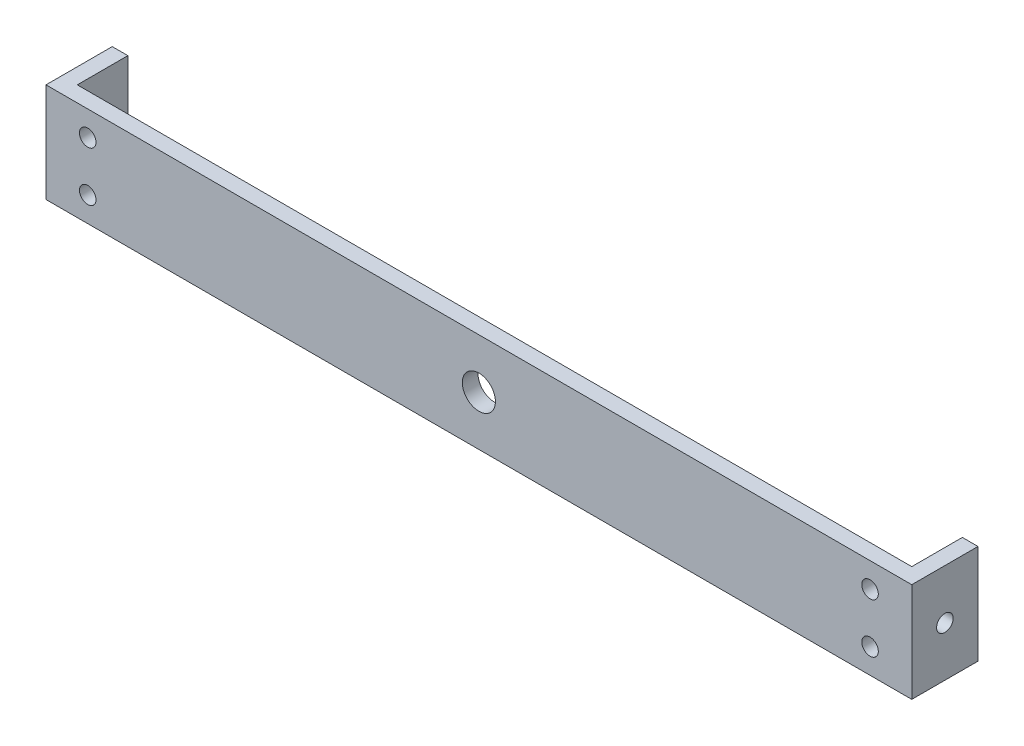
ISO-10303-21;
HEADER;
FILE_DESCRIPTION(('STEP AP214'),'2;1');
FILE_NAME('part.step','',(''),(''),'','','');
FILE_SCHEMA(('AUTOMOTIVE_DESIGN { 1 0 10303 214 1 1 1 1 }'));
ENDSEC;
DATA;
#1=APPLICATION_CONTEXT('core data for automotive mechanical design processes');
#2=APPLICATION_PROTOCOL_DEFINITION('international standard','automotive_design',2000,#1);
#3=PRODUCT_CONTEXT('',#1,'mechanical');
#4=PRODUCT('Part','Part','',(#3));
#5=PRODUCT_RELATED_PRODUCT_CATEGORY('part','',(#4));
#6=PRODUCT_DEFINITION_FORMATION('','',#4);
#7=PRODUCT_DEFINITION_CONTEXT('part definition',#1,'design');
#8=PRODUCT_DEFINITION('design','',#6,#7);
#9=PRODUCT_DEFINITION_SHAPE('','',#8);
#10=(LENGTH_UNIT() NAMED_UNIT(*) SI_UNIT(.MILLI.,.METRE.));
#11=(NAMED_UNIT(*) PLANE_ANGLE_UNIT() SI_UNIT($,.RADIAN.));
#12=(NAMED_UNIT(*) SI_UNIT($,.STERADIAN.) SOLID_ANGLE_UNIT());
#13=UNCERTAINTY_MEASURE_WITH_UNIT(LENGTH_MEASURE(1.E-05),#10,'distance_accuracy_value','');
#14=(GEOMETRIC_REPRESENTATION_CONTEXT(3) GLOBAL_UNCERTAINTY_ASSIGNED_CONTEXT((#13)) GLOBAL_UNIT_ASSIGNED_CONTEXT((#10,
#11,#12)) REPRESENTATION_CONTEXT('',''));
#15=CARTESIAN_POINT('',(0.,0.,0.));
#16=DIRECTION('',(0.,0.,1.));
#17=DIRECTION('',(1.,0.,0.));
#18=AXIS2_PLACEMENT_3D('',#15,#16,#17);
#19=CARTESIAN_POINT('',(-182.712979417389,0.,-6.7));
#20=DIRECTION('',(1.,0.,0.));
#21=DIRECTION('',(0.,0.,-1.));
#22=AXIS2_PLACEMENT_3D('',#19,#20,#21);
#23=CYLINDRICAL_SURFACE('',#22,3.17500000000015);
#24=CARTESIAN_POINT('',(-166.,0.,-6.7));
#25=DIRECTION('',(1.,0.,0.));
#26=DIRECTION('',(0.,0.,-1.));
#27=AXIS2_PLACEMENT_3D('',#24,#25,#26);
#28=CIRCLE('',#27,3.17500000000015);
#29=CARTESIAN_POINT('',(-166.,0.,-9.87500000000015));
#30=VERTEX_POINT('',#29);
#31=EDGE_CURVE('E141',#30,#30,#28,.T.);
#32=ORIENTED_EDGE('',*,*,#31,.F.);
#33=EDGE_LOOP('',(#32));
#34=FACE_BOUND('',#33,.T.);
#35=CARTESIAN_POINT('',(-160.,0.,-6.7));
#36=DIRECTION('',(1.,0.,0.));
#37=DIRECTION('',(0.,0.,-1.));
#38=AXIS2_PLACEMENT_3D('',#35,#36,#37);
#39=CIRCLE('',#38,3.17500000000015);
#40=CARTESIAN_POINT('',(-160.,0.,-9.87500000000015));
#41=VERTEX_POINT('',#40);
#42=EDGE_CURVE('E20',#41,#41,#39,.F.);
#43=ORIENTED_EDGE('',*,*,#42,.F.);
#44=EDGE_LOOP('',(#43));
#45=FACE_BOUND('',#44,.T.);
#46=ADVANCED_FACE('F17',(#34,#45),#23,.F.);
#47=CARTESIAN_POINT('',(-160.,19.05,-19.4));
#48=DIRECTION('',(1.,0.,0.));
#49=DIRECTION('',(0.,0.,-1.));
#50=AXIS2_PLACEMENT_3D('',#47,#48,#49);
#51=PLANE('',#50);
#52=DIRECTION('',(0.,0.,1.));
#53=VECTOR('',#52,1.);
#54=CARTESIAN_POINT('',(-160.,-19.05,6.));
#55=LINE('',#54,#53);
#56=CARTESIAN_POINT('',(-160.,-19.05,0.));
#57=VERTEX_POINT('',#56);
#58=CARTESIAN_POINT('',(-160.,-19.05,-19.4));
#59=VERTEX_POINT('',#58);
#60=EDGE_CURVE('E241',#57,#59,#55,.F.);
#61=ORIENTED_EDGE('',*,*,#60,.T.);
#62=DIRECTION('',(0.,1.,0.));
#63=VECTOR('',#62,1.);
#64=CARTESIAN_POINT('',(-160.,0.,-19.4));
#65=LINE('',#64,#63);
#66=CARTESIAN_POINT('',(-160.,19.05,-19.4));
#67=VERTEX_POINT('',#66);
#68=EDGE_CURVE('E118',#67,#59,#65,.F.);
#69=ORIENTED_EDGE('',*,*,#68,.F.);
#70=DIRECTION('',(0.,0.,1.));
#71=VECTOR('',#70,1.);
#72=CARTESIAN_POINT('',(-160.,19.05,6.));
#73=LINE('',#72,#71);
#74=CARTESIAN_POINT('',(-160.,19.05,0.));
#75=VERTEX_POINT('',#74);
#76=EDGE_CURVE('E110',#67,#75,#73,.T.);
#77=ORIENTED_EDGE('',*,*,#76,.T.);
#78=DIRECTION('',(0.,1.,0.));
#79=VECTOR('',#78,1.);
#80=CARTESIAN_POINT('',(-160.,0.,0.));
#81=LINE('',#80,#79);
#82=EDGE_CURVE('E114',#75,#57,#81,.F.);
#83=ORIENTED_EDGE('',*,*,#82,.T.);
#84=EDGE_LOOP('',(#61,#69,#77,#83));
#85=FACE_BOUND('',#84,.T.);
#86=ORIENTED_EDGE('',*,*,#42,.T.);
#87=EDGE_LOOP('',(#86));
#88=FACE_BOUND('',#87,.T.);
#89=ADVANCED_FACE('F274',(#85,#88),#51,.T.);
#90=CARTESIAN_POINT('',(0.,0.,-19.4));
#91=DIRECTION('',(0.,0.,-1.));
#92=DIRECTION('',(-1.,0.,0.));
#93=AXIS2_PLACEMENT_3D('',#90,#91,#92);
#94=PLANE('',#93);
#95=DIRECTION('',(0.,1.,0.));
#96=VECTOR('',#95,1.);
#97=CARTESIAN_POINT('',(-166.,19.05,-19.4));
#98=LINE('',#97,#96);
#99=CARTESIAN_POINT('',(-166.,19.05,-19.4));
#100=VERTEX_POINT('',#99);
#101=CARTESIAN_POINT('',(-166.,-19.05,-19.4));
#102=VERTEX_POINT('',#101);
#103=EDGE_CURVE('E238',#100,#102,#98,.F.);
#104=ORIENTED_EDGE('',*,*,#103,.F.);
#105=DIRECTION('',(1.,0.,0.));
#106=VECTOR('',#105,1.);
#107=CARTESIAN_POINT('',(160.,19.0500000000001,-19.4));
#108=LINE('',#107,#106);
#109=EDGE_CURVE('E107',#100,#67,#108,.T.);
#110=ORIENTED_EDGE('',*,*,#109,.T.);
#111=ORIENTED_EDGE('',*,*,#68,.T.);
#112=DIRECTION('',(-1.,0.,0.));
#113=VECTOR('',#112,1.);
#114=CARTESIAN_POINT('',(160.,-19.05,-19.4));
#115=LINE('',#114,#113);
#116=EDGE_CURVE('E243',#59,#102,#115,.T.);
#117=ORIENTED_EDGE('',*,*,#116,.T.);
#118=EDGE_LOOP('',(#104,#110,#111,#117));
#119=FACE_BOUND('',#118,.T.);
#120=ADVANCED_FACE('F169',(#119),#94,.T.);
#121=CARTESIAN_POINT('',(160.,19.0500000000001,-19.4));
#122=DIRECTION('',(-1.,0.,0.));
#123=DIRECTION('',(0.,0.,1.));
#124=AXIS2_PLACEMENT_3D('',#121,#122,#123);
#125=PLANE('',#124);
#126=DIRECTION('',(0.,0.,1.));
#127=VECTOR('',#126,1.);
#128=CARTESIAN_POINT('',(160.,19.0500000000001,6.));
#129=LINE('',#128,#127);
#130=CARTESIAN_POINT('',(160.,19.0500000000001,0.));
#131=VERTEX_POINT('',#130);
#132=CARTESIAN_POINT('',(160.,19.0500000000001,-19.4));
#133=VERTEX_POINT('',#132);
#134=EDGE_CURVE('E82',#131,#133,#129,.F.);
#135=ORIENTED_EDGE('',*,*,#134,.T.);
#136=DIRECTION('',(0.,1.,0.));
#137=VECTOR('',#136,1.);
#138=CARTESIAN_POINT('',(160.,0.,-19.4));
#139=LINE('',#138,#137);
#140=CARTESIAN_POINT('',(160.,-19.05,-19.4));
#141=VERTEX_POINT('',#140);
#142=EDGE_CURVE('E86',#133,#141,#139,.F.);
#143=ORIENTED_EDGE('',*,*,#142,.T.);
#144=DIRECTION('',(0.,0.,1.));
#145=VECTOR('',#144,1.);
#146=CARTESIAN_POINT('',(160.,-19.05,6.));
#147=LINE('',#146,#145);
#148=CARTESIAN_POINT('',(160.,-19.05,0.));
#149=VERTEX_POINT('',#148);
#150=EDGE_CURVE('E248',#141,#149,#147,.T.);
#151=ORIENTED_EDGE('',*,*,#150,.T.);
#152=DIRECTION('',(0.,1.,0.));
#153=VECTOR('',#152,1.);
#154=CARTESIAN_POINT('',(160.,0.,0.));
#155=LINE('',#154,#153);
#156=EDGE_CURVE('E79',#149,#131,#155,.T.);
#157=ORIENTED_EDGE('',*,*,#156,.T.);
#158=EDGE_LOOP('',(#135,#143,#151,#157));
#159=FACE_BOUND('',#158,.T.);
#160=CARTESIAN_POINT('',(160.,0.,-6.7));
#161=DIRECTION('',(1.,0.,0.));
#162=DIRECTION('',(0.,0.,-1.));
#163=AXIS2_PLACEMENT_3D('',#160,#161,#162);
#164=CIRCLE('',#163,3.17500000000015);
#165=CARTESIAN_POINT('',(160.,0.,-9.87500000000015));
#166=VERTEX_POINT('',#165);
#167=EDGE_CURVE('E100',#166,#166,#164,.T.);
#168=ORIENTED_EDGE('',*,*,#167,.T.);
#169=EDGE_LOOP('',(#168));
#170=FACE_BOUND('',#169,.T.);
#171=ADVANCED_FACE('F84',(#159,#170),#125,.T.);
#172=CARTESIAN_POINT('',(-182.712979417389,0.,-6.7));
#173=DIRECTION('',(1.,0.,0.));
#174=DIRECTION('',(0.,0.,-1.));
#175=AXIS2_PLACEMENT_3D('',#172,#173,#174);
#176=CYLINDRICAL_SURFACE('',#175,3.17500000000015);
#177=CARTESIAN_POINT('',(166.,0.,-6.7));
#178=DIRECTION('',(1.,0.,0.));
#179=DIRECTION('',(0.,0.,-1.));
#180=AXIS2_PLACEMENT_3D('',#177,#178,#179);
#181=CIRCLE('',#180,3.17500000000015);
#182=CARTESIAN_POINT('',(166.,0.,-9.87500000000015));
#183=VERTEX_POINT('',#182);
#184=EDGE_CURVE('E137',#183,#183,#181,.F.);
#185=ORIENTED_EDGE('',*,*,#184,.F.);
#186=EDGE_LOOP('',(#185));
#187=FACE_BOUND('',#186,.T.);
#188=ORIENTED_EDGE('',*,*,#167,.F.);
#189=EDGE_LOOP('',(#188));
#190=FACE_BOUND('',#189,.T.);
#191=ADVANCED_FACE('F158',(#187,#190),#176,.F.);
#192=CARTESIAN_POINT('',(0.,0.,-19.4));
#193=DIRECTION('',(0.,0.,1.));
#194=DIRECTION('',(1.,0.,0.));
#195=AXIS2_PLACEMENT_3D('',#192,#193,#194);
#196=PLANE('',#195);
#197=DIRECTION('',(1.,0.,0.));
#198=VECTOR('',#197,1.);
#199=CARTESIAN_POINT('',(160.,19.0500000000001,-19.4));
#200=LINE('',#199,#198);
#201=CARTESIAN_POINT('',(166.,19.0500000000001,-19.4));
#202=VERTEX_POINT('',#201);
#203=EDGE_CURVE('E91',#133,#202,#200,.T.);
#204=ORIENTED_EDGE('',*,*,#203,.T.);
#205=DIRECTION('',(0.,1.,0.));
#206=VECTOR('',#205,1.);
#207=CARTESIAN_POINT('',(166.,19.0500000000001,-19.4));
#208=LINE('',#207,#206);
#209=CARTESIAN_POINT('',(166.,-19.05,-19.4));
#210=VERTEX_POINT('',#209);
#211=EDGE_CURVE('E252',#210,#202,#208,.T.);
#212=ORIENTED_EDGE('',*,*,#211,.F.);
#213=DIRECTION('',(-1.,0.,0.));
#214=VECTOR('',#213,1.);
#215=CARTESIAN_POINT('',(160.,-19.05,-19.4));
#216=LINE('',#215,#214);
#217=EDGE_CURVE('E98',#210,#141,#216,.T.);
#218=ORIENTED_EDGE('',*,*,#217,.T.);
#219=ORIENTED_EDGE('',*,*,#142,.F.);
#220=EDGE_LOOP('',(#204,#212,#218,#219));
#221=FACE_BOUND('',#220,.T.);
#222=ADVANCED_FACE('F95',(#221),#196,.F.);
#223=CARTESIAN_POINT('',(0.,0.,0.));
#224=DIRECTION('',(0.,0.,1.));
#225=DIRECTION('',(1.,0.,0.));
#226=AXIS2_PLACEMENT_3D('',#223,#224,#225);
#227=PLANE('',#226);
#228=CARTESIAN_POINT('',(0.,0.,0.));
#229=DIRECTION('',(0.,0.,-1.));
#230=DIRECTION('',(-1.,0.,0.));
#231=AXIS2_PLACEMENT_3D('',#228,#229,#230);
#232=CIRCLE('',#231,6.35);
#233=CARTESIAN_POINT('',(-6.34999999999994,0.,0.));
#234=VERTEX_POINT('',#233);
#235=EDGE_CURVE('E134',#234,#234,#232,.F.);
#236=ORIENTED_EDGE('',*,*,#235,.T.);
#237=EDGE_LOOP('',(#236));
#238=FACE_BOUND('',#237,.T.);
#239=DIRECTION('',(1.,0.,0.));
#240=VECTOR('',#239,1.);
#241=CARTESIAN_POINT('',(160.,19.0500000000001,0.));
#242=LINE('',#241,#240);
#243=EDGE_CURVE('E145',#75,#131,#242,.T.);
#244=ORIENTED_EDGE('',*,*,#243,.T.);
#245=ORIENTED_EDGE('',*,*,#156,.F.);
#246=DIRECTION('',(-1.,0.,0.));
#247=VECTOR('',#246,1.);
#248=CARTESIAN_POINT('',(160.,-19.05,0.));
#249=LINE('',#248,#247);
#250=EDGE_CURVE('E140',#149,#57,#249,.T.);
#251=ORIENTED_EDGE('',*,*,#250,.T.);
#252=ORIENTED_EDGE('',*,*,#82,.F.);
#253=EDGE_LOOP('',(#244,#245,#251,#252));
#254=FACE_BOUND('',#253,.T.);
#255=CARTESIAN_POINT('',(-150.,9.52500000000004,0.));
#256=DIRECTION('',(0.,0.,-1.));
#257=DIRECTION('',(-1.,0.,0.));
#258=AXIS2_PLACEMENT_3D('',#255,#256,#257);
#259=CIRCLE('',#258,3.17500000000001);
#260=CARTESIAN_POINT('',(-153.175,9.52500000000004,0.));
#261=VERTEX_POINT('',#260);
#262=EDGE_CURVE('E92',#261,#261,#259,.F.);
#263=ORIENTED_EDGE('',*,*,#262,.T.);
#264=EDGE_LOOP('',(#263));
#265=FACE_BOUND('',#264,.T.);
#266=CARTESIAN_POINT('',(150.,9.52500000000026,0.));
#267=DIRECTION('',(0.,0.,-1.));
#268=DIRECTION('',(-1.,0.,0.));
#269=AXIS2_PLACEMENT_3D('',#266,#267,#268);
#270=CIRCLE('',#269,3.17500000000001);
#271=CARTESIAN_POINT('',(146.825,9.52500000000026,0.));
#272=VERTEX_POINT('',#271);
#273=EDGE_CURVE('E148',#272,#272,#270,.F.);
#274=ORIENTED_EDGE('',*,*,#273,.T.);
#275=EDGE_LOOP('',(#274));
#276=FACE_BOUND('',#275,.T.);
#277=CARTESIAN_POINT('',(150.,-9.52499999999975,0.));
#278=DIRECTION('',(0.,0.,-1.));
#279=DIRECTION('',(-1.,0.,0.));
#280=AXIS2_PLACEMENT_3D('',#277,#278,#279);
#281=CIRCLE('',#280,3.17500000000001);
#282=CARTESIAN_POINT('',(146.825,-9.52499999999975,0.));
#283=VERTEX_POINT('',#282);
#284=EDGE_CURVE('E151',#283,#283,#281,.F.);
#285=ORIENTED_EDGE('',*,*,#284,.T.);
#286=EDGE_LOOP('',(#285));
#287=FACE_BOUND('',#286,.T.);
#288=CARTESIAN_POINT('',(-150.,-9.52499999999997,0.));
#289=DIRECTION('',(0.,0.,-1.));
#290=DIRECTION('',(-1.,0.,0.));
#291=AXIS2_PLACEMENT_3D('',#288,#289,#290);
#292=CIRCLE('',#291,3.17500000000001);
#293=CARTESIAN_POINT('',(-153.175,-9.52499999999997,0.));
#294=VERTEX_POINT('',#293);
#295=EDGE_CURVE('E116',#294,#294,#292,.F.);
#296=ORIENTED_EDGE('',*,*,#295,.T.);
#297=EDGE_LOOP('',(#296));
#298=FACE_BOUND('',#297,.T.);
#299=ADVANCED_FACE('F167',(#238,#254,#265,#276,#287,#298),#227,.F.);
#300=CARTESIAN_POINT('',(-150.,-9.52499999999997,25.4));
#301=DIRECTION('',(0.,0.,-1.));
#302=DIRECTION('',(-1.,0.,0.));
#303=AXIS2_PLACEMENT_3D('',#300,#301,#302);
#304=CYLINDRICAL_SURFACE('',#303,3.17500000000001);
#305=CARTESIAN_POINT('',(-150.,-9.52499999999997,6.));
#306=DIRECTION('',(0.,0.,-1.));
#307=DIRECTION('',(-1.,0.,0.));
#308=AXIS2_PLACEMENT_3D('',#305,#306,#307);
#309=CIRCLE('',#308,3.17500000000001);
#310=CARTESIAN_POINT('',(-153.175,-9.52499999999997,6.));
#311=VERTEX_POINT('',#310);
#312=EDGE_CURVE('E131',#311,#311,#309,.T.);
#313=ORIENTED_EDGE('',*,*,#312,.F.);
#314=EDGE_LOOP('',(#313));
#315=FACE_BOUND('',#314,.T.);
#316=ORIENTED_EDGE('',*,*,#295,.F.);
#317=EDGE_LOOP('',(#316));
#318=FACE_BOUND('',#317,.T.);
#319=ADVANCED_FACE('F208',(#315,#318),#304,.F.);
#320=CARTESIAN_POINT('',(150.,-9.52499999999975,25.4));
#321=DIRECTION('',(0.,0.,-1.));
#322=DIRECTION('',(-1.,0.,0.));
#323=AXIS2_PLACEMENT_3D('',#320,#321,#322);
#324=CYLINDRICAL_SURFACE('',#323,3.17500000000001);
#325=CARTESIAN_POINT('',(150.,-9.52499999999975,6.));
#326=DIRECTION('',(0.,0.,-1.));
#327=DIRECTION('',(-1.,0.,0.));
#328=AXIS2_PLACEMENT_3D('',#325,#326,#327);
#329=CIRCLE('',#328,3.17500000000001);
#330=CARTESIAN_POINT('',(146.825,-9.52499999999975,6.));
#331=VERTEX_POINT('',#330);
#332=EDGE_CURVE('E128',#331,#331,#329,.T.);
#333=ORIENTED_EDGE('',*,*,#332,.F.);
#334=EDGE_LOOP('',(#333));
#335=FACE_BOUND('',#334,.T.);
#336=ORIENTED_EDGE('',*,*,#284,.F.);
#337=EDGE_LOOP('',(#336));
#338=FACE_BOUND('',#337,.T.);
#339=ADVANCED_FACE('F204',(#335,#338),#324,.F.);
#340=CARTESIAN_POINT('',(150.,9.52500000000026,25.4));
#341=DIRECTION('',(0.,0.,-1.));
#342=DIRECTION('',(-1.,0.,0.));
#343=AXIS2_PLACEMENT_3D('',#340,#341,#342);
#344=CYLINDRICAL_SURFACE('',#343,3.17500000000001);
#345=CARTESIAN_POINT('',(150.,9.52500000000026,6.));
#346=DIRECTION('',(0.,0.,-1.));
#347=DIRECTION('',(-1.,0.,0.));
#348=AXIS2_PLACEMENT_3D('',#345,#346,#347);
#349=CIRCLE('',#348,3.17500000000001);
#350=CARTESIAN_POINT('',(146.825,9.52500000000026,6.));
#351=VERTEX_POINT('',#350);
#352=EDGE_CURVE('E125',#351,#351,#349,.T.);
#353=ORIENTED_EDGE('',*,*,#352,.F.);
#354=EDGE_LOOP('',(#353));
#355=FACE_BOUND('',#354,.T.);
#356=ORIENTED_EDGE('',*,*,#273,.F.);
#357=EDGE_LOOP('',(#356));
#358=FACE_BOUND('',#357,.T.);
#359=ADVANCED_FACE('F200',(#355,#358),#344,.F.);
#360=CARTESIAN_POINT('',(-150.,9.52500000000004,25.4));
#361=DIRECTION('',(0.,0.,-1.));
#362=DIRECTION('',(-1.,0.,0.));
#363=AXIS2_PLACEMENT_3D('',#360,#361,#362);
#364=CYLINDRICAL_SURFACE('',#363,3.17500000000001);
#365=CARTESIAN_POINT('',(-150.,9.52500000000004,6.));
#366=DIRECTION('',(0.,0.,-1.));
#367=DIRECTION('',(-1.,0.,0.));
#368=AXIS2_PLACEMENT_3D('',#365,#366,#367);
#369=CIRCLE('',#368,3.17500000000001);
#370=CARTESIAN_POINT('',(-153.175,9.52500000000004,6.));
#371=VERTEX_POINT('',#370);
#372=EDGE_CURVE('E121',#371,#371,#369,.T.);
#373=ORIENTED_EDGE('',*,*,#372,.F.);
#374=EDGE_LOOP('',(#373));
#375=FACE_BOUND('',#374,.T.);
#376=ORIENTED_EDGE('',*,*,#262,.F.);
#377=EDGE_LOOP('',(#376));
#378=FACE_BOUND('',#377,.T.);
#379=ADVANCED_FACE('F197',(#375,#378),#364,.F.);
#380=CARTESIAN_POINT('',(160.,19.0500000000001,6.));
#381=DIRECTION('',(0.,-1.,0.));
#382=DIRECTION('',(1.,0.,0.));
#383=AXIS2_PLACEMENT_3D('',#380,#381,#382);
#384=PLANE('',#383);
#385=ORIENTED_EDGE('',*,*,#76,.F.);
#386=ORIENTED_EDGE('',*,*,#109,.F.);
#387=DIRECTION('',(0.,0.,1.));
#388=VECTOR('',#387,1.);
#389=CARTESIAN_POINT('',(-166.,19.05,-19.4));
#390=LINE('',#389,#388);
#391=CARTESIAN_POINT('',(-166.,19.05,6.));
#392=VERTEX_POINT('',#391);
#393=EDGE_CURVE('E144',#392,#100,#390,.F.);
#394=ORIENTED_EDGE('',*,*,#393,.F.);
#395=DIRECTION('',(1.,0.,0.));
#396=VECTOR('',#395,1.);
#397=CARTESIAN_POINT('',(0.,19.0500000000001,6.));
#398=LINE('',#397,#396);
#399=CARTESIAN_POINT('',(166.,19.0500000000001,6.));
#400=VERTEX_POINT('',#399);
#401=EDGE_CURVE('E124',#400,#392,#398,.F.);
#402=ORIENTED_EDGE('',*,*,#401,.F.);
#403=DIRECTION('',(0.,0.,-1.));
#404=VECTOR('',#403,1.);
#405=CARTESIAN_POINT('',(166.,19.0500000000001,-19.4));
#406=LINE('',#405,#404);
#407=EDGE_CURVE('E105',#202,#400,#406,.F.);
#408=ORIENTED_EDGE('',*,*,#407,.F.);
#409=ORIENTED_EDGE('',*,*,#203,.F.);
#410=ORIENTED_EDGE('',*,*,#134,.F.);
#411=ORIENTED_EDGE('',*,*,#243,.F.);
#412=EDGE_LOOP('',(#385,#386,#394,#402,#408,#409,#410,#411));
#413=FACE_BOUND('',#412,.T.);
#414=ADVANCED_FACE('F103',(#413),#384,.F.);
#415=CARTESIAN_POINT('',(-166.,19.05,-19.4));
#416=DIRECTION('',(-1.,0.,0.));
#417=DIRECTION('',(0.,0.,1.));
#418=AXIS2_PLACEMENT_3D('',#415,#416,#417);
#419=PLANE('',#418);
#420=ORIENTED_EDGE('',*,*,#103,.T.);
#421=DIRECTION('',(0.,0.,1.));
#422=VECTOR('',#421,1.);
#423=CARTESIAN_POINT('',(-166.,-19.05,6.));
#424=LINE('',#423,#422);
#425=CARTESIAN_POINT('',(-166.,-19.05,6.));
#426=VERTEX_POINT('',#425);
#427=EDGE_CURVE('E245',#102,#426,#424,.T.);
#428=ORIENTED_EDGE('',*,*,#427,.T.);
#429=DIRECTION('',(0.,1.,0.));
#430=VECTOR('',#429,1.);
#431=CARTESIAN_POINT('',(-166.,0.,6.));
#432=LINE('',#431,#430);
#433=EDGE_CURVE('E257',#392,#426,#432,.F.);
#434=ORIENTED_EDGE('',*,*,#433,.F.);
#435=ORIENTED_EDGE('',*,*,#393,.T.);
#436=EDGE_LOOP('',(#420,#428,#434,#435));
#437=FACE_BOUND('',#436,.T.);
#438=ORIENTED_EDGE('',*,*,#31,.T.);
#439=EDGE_LOOP('',(#438));
#440=FACE_BOUND('',#439,.T.);
#441=ADVANCED_FACE('F191',(#437,#440),#419,.T.);
#442=CARTESIAN_POINT('',(160.,-19.05,6.));
#443=DIRECTION('',(0.,1.,0.));
#444=DIRECTION('',(-1.,0.,0.));
#445=AXIS2_PLACEMENT_3D('',#442,#443,#444);
#446=PLANE('',#445);
#447=ORIENTED_EDGE('',*,*,#150,.F.);
#448=ORIENTED_EDGE('',*,*,#217,.F.);
#449=DIRECTION('',(0.,0.,-1.));
#450=VECTOR('',#449,1.);
#451=CARTESIAN_POINT('',(166.,-19.05,-19.4));
#452=LINE('',#451,#450);
#453=CARTESIAN_POINT('',(166.,-19.05,6.));
#454=VERTEX_POINT('',#453);
#455=EDGE_CURVE('E35',#454,#210,#452,.T.);
#456=ORIENTED_EDGE('',*,*,#455,.F.);
#457=DIRECTION('',(1.,0.,0.));
#458=VECTOR('',#457,1.);
#459=CARTESIAN_POINT('',(0.,-19.05,6.));
#460=LINE('',#459,#458);
#461=EDGE_CURVE('E260',#426,#454,#460,.T.);
#462=ORIENTED_EDGE('',*,*,#461,.F.);
#463=ORIENTED_EDGE('',*,*,#427,.F.);
#464=ORIENTED_EDGE('',*,*,#116,.F.);
#465=ORIENTED_EDGE('',*,*,#60,.F.);
#466=ORIENTED_EDGE('',*,*,#250,.F.);
#467=EDGE_LOOP('',(#447,#448,#456,#462,#463,#464,#465,#466));
#468=FACE_BOUND('',#467,.T.);
#469=ADVANCED_FACE('F187',(#468),#446,.F.);
#470=CARTESIAN_POINT('',(166.,19.0500000000001,-19.4));
#471=DIRECTION('',(1.,0.,0.));
#472=DIRECTION('',(0.,0.,-1.));
#473=AXIS2_PLACEMENT_3D('',#470,#471,#472);
#474=PLANE('',#473);
#475=ORIENTED_EDGE('',*,*,#211,.T.);
#476=ORIENTED_EDGE('',*,*,#407,.T.);
#477=DIRECTION('',(0.,1.,0.));
#478=VECTOR('',#477,1.);
#479=CARTESIAN_POINT('',(166.,0.,6.));
#480=LINE('',#479,#478);
#481=EDGE_CURVE('E26',#454,#400,#480,.T.);
#482=ORIENTED_EDGE('',*,*,#481,.F.);
#483=ORIENTED_EDGE('',*,*,#455,.T.);
#484=EDGE_LOOP('',(#475,#476,#482,#483));
#485=FACE_BOUND('',#484,.T.);
#486=ORIENTED_EDGE('',*,*,#184,.T.);
#487=EDGE_LOOP('',(#486));
#488=FACE_BOUND('',#487,.T.);
#489=ADVANCED_FACE('F180',(#485,#488),#474,.T.);
#490=CARTESIAN_POINT('',(0.,0.,6.));
#491=DIRECTION('',(0.,0.,-1.));
#492=DIRECTION('',(-1.,0.,0.));
#493=AXIS2_PLACEMENT_3D('',#490,#491,#492);
#494=CYLINDRICAL_SURFACE('',#493,6.35);
#495=CARTESIAN_POINT('',(0.,0.,6.));
#496=DIRECTION('',(0.,0.,-1.));
#497=DIRECTION('',(-1.,0.,0.));
#498=AXIS2_PLACEMENT_3D('',#495,#496,#497);
#499=CIRCLE('',#498,6.35);
#500=CARTESIAN_POINT('',(-6.34999999999994,0.,6.));
#501=VERTEX_POINT('',#500);
#502=EDGE_CURVE('E11',#501,#501,#499,.T.);
#503=ORIENTED_EDGE('',*,*,#502,.F.);
#504=EDGE_LOOP('',(#503));
#505=FACE_BOUND('',#504,.T.);
#506=ORIENTED_EDGE('',*,*,#235,.F.);
#507=EDGE_LOOP('',(#506));
#508=FACE_BOUND('',#507,.T.);
#509=ADVANCED_FACE('F174',(#505,#508),#494,.F.);
#510=CARTESIAN_POINT('',(0.,0.,6.));
#511=DIRECTION('',(0.,0.,1.));
#512=DIRECTION('',(1.,0.,0.));
#513=AXIS2_PLACEMENT_3D('',#510,#511,#512);
#514=PLANE('',#513);
#515=ORIENTED_EDGE('',*,*,#502,.T.);
#516=EDGE_LOOP('',(#515));
#517=FACE_BOUND('',#516,.T.);
#518=ORIENTED_EDGE('',*,*,#461,.T.);
#519=ORIENTED_EDGE('',*,*,#481,.T.);
#520=ORIENTED_EDGE('',*,*,#401,.T.);
#521=ORIENTED_EDGE('',*,*,#433,.T.);
#522=EDGE_LOOP('',(#518,#519,#520,#521));
#523=FACE_BOUND('',#522,.T.);
#524=ORIENTED_EDGE('',*,*,#372,.T.);
#525=EDGE_LOOP('',(#524));
#526=FACE_BOUND('',#525,.T.);
#527=ORIENTED_EDGE('',*,*,#352,.T.);
#528=EDGE_LOOP('',(#527));
#529=FACE_BOUND('',#528,.T.);
#530=ORIENTED_EDGE('',*,*,#332,.T.);
#531=EDGE_LOOP('',(#530));
#532=FACE_BOUND('',#531,.T.);
#533=ORIENTED_EDGE('',*,*,#312,.T.);
#534=EDGE_LOOP('',(#533));
#535=FACE_BOUND('',#534,.T.);
#536=ADVANCED_FACE('F172',(#517,#523,#526,#529,#532,#535),#514,.T.);
#537=CLOSED_SHELL('',(#46,#89,#120,#171,#191,#222,#299,#319,#339,#359,#379,#414,#441,#469,#489,
#509,#536));
#538=MANIFOLD_SOLID_BREP('B1',#537);
#539=ADVANCED_BREP_SHAPE_REPRESENTATION('',(#18,#538),#14);
#540=SHAPE_DEFINITION_REPRESENTATION(#9,#539);
ENDSEC;
END-ISO-10303-21;
